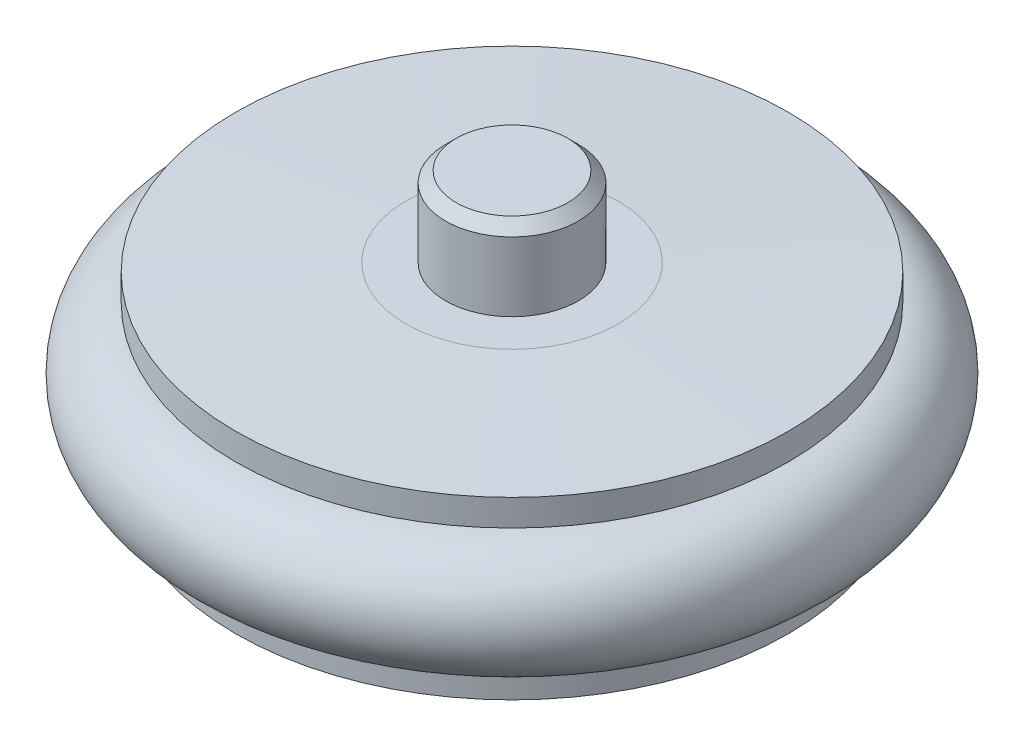
ISO-10303-21;
HEADER;
FILE_DESCRIPTION(('STEP AP214'),'2;1');
FILE_NAME('part.step','',(''),(''),'','','');
FILE_SCHEMA(('AUTOMOTIVE_DESIGN { 1 0 10303 214 1 1 1 1 }'));
ENDSEC;
DATA;
#1=APPLICATION_CONTEXT('core data for automotive mechanical design processes');
#2=APPLICATION_PROTOCOL_DEFINITION('international standard','automotive_design',2000,#1);
#3=PRODUCT_CONTEXT('',#1,'mechanical');
#4=PRODUCT('Part','Part','',(#3));
#5=PRODUCT_RELATED_PRODUCT_CATEGORY('part','',(#4));
#6=PRODUCT_DEFINITION_FORMATION('','',#4);
#7=PRODUCT_DEFINITION_CONTEXT('part definition',#1,'design');
#8=PRODUCT_DEFINITION('design','',#6,#7);
#9=PRODUCT_DEFINITION_SHAPE('','',#8);
#10=(LENGTH_UNIT() NAMED_UNIT(*) SI_UNIT(.MILLI.,.METRE.));
#11=(NAMED_UNIT(*) PLANE_ANGLE_UNIT() SI_UNIT($,.RADIAN.));
#12=(NAMED_UNIT(*) SI_UNIT($,.STERADIAN.) SOLID_ANGLE_UNIT());
#13=UNCERTAINTY_MEASURE_WITH_UNIT(LENGTH_MEASURE(1.E-05),#10,'distance_accuracy_value','');
#14=(GEOMETRIC_REPRESENTATION_CONTEXT(3) GLOBAL_UNCERTAINTY_ASSIGNED_CONTEXT((#13)) GLOBAL_UNIT_ASSIGNED_CONTEXT((#10,
#11,#12)) REPRESENTATION_CONTEXT('',''));
#15=CARTESIAN_POINT('',(0.,0.,0.));
#16=DIRECTION('',(0.,0.,1.));
#17=DIRECTION('',(1.,0.,0.));
#18=AXIS2_PLACEMENT_3D('',#15,#16,#17);
#19=CARTESIAN_POINT('',(0.,0.,0.));
#20=DIRECTION('',(0.,1.,0.));
#21=DIRECTION('',(0.,0.,1.));
#22=AXIS2_PLACEMENT_3D('',#19,#20,#21);
#23=TOROIDAL_SURFACE('',#22,5.1,1.1);
#24=CARTESIAN_POINT('',(0.,0.,6.2));
#25=VERTEX_POINT('',#24);
#26=VERTEX_LOOP('',#25);
#27=FACE_BOUND('',#26,.T.);
#28=ADVANCED_FACE('F41',(#27),#23,.T.);
#29=CLOSED_SHELL('',(#28));
#30=MANIFOLD_SOLID_BREP('B2',#29);
#31=CARTESIAN_POINT('',(0.,3.10000000000011,0.));
#32=DIRECTION('',(0.,-1.,0.));
#33=DIRECTION('',(0.,0.,-1.));
#34=AXIS2_PLACEMENT_3D('',#31,#32,#33);
#35=CONICAL_SURFACE('',#34,1.25000000000003,0.785398163397749);
#36=CARTESIAN_POINT('',(0.,3.3,0.));
#37=DIRECTION('',(0.,-1.,0.));
#38=DIRECTION('',(0.,0.,-1.));
#39=AXIS2_PLACEMENT_3D('',#36,#37,#38);
#40=CIRCLE('',#39,1.05000000000002);
#41=CARTESIAN_POINT('',(0.,3.3,-1.05000000000002));
#42=VERTEX_POINT('',#41);
#43=EDGE_CURVE('E100',#42,#42,#40,.T.);
#44=ORIENTED_EDGE('',*,*,#43,.T.);
#45=EDGE_LOOP('',(#44));
#46=FACE_BOUND('',#45,.T.);
#47=CARTESIAN_POINT('',(0.,3.10000000000011,0.));
#48=DIRECTION('',(0.,-1.,0.));
#49=DIRECTION('',(0.,0.,-1.));
#50=AXIS2_PLACEMENT_3D('',#47,#48,#49);
#51=CIRCLE('',#50,1.25000000000003);
#52=CARTESIAN_POINT('',(0.,3.10000000000011,-1.25000000000003));
#53=VERTEX_POINT('',#52);
#54=EDGE_CURVE('E40',#53,#53,#51,.T.);
#55=ORIENTED_EDGE('',*,*,#54,.F.);
#56=EDGE_LOOP('',(#55));
#57=FACE_BOUND('',#56,.T.);
#58=ADVANCED_FACE('F54',(#46,#57),#35,.T.);
#59=CARTESIAN_POINT('',(0.,3.3,0.));
#60=DIRECTION('',(0.,-1.,0.));
#61=DIRECTION('',(0.,0.,-1.));
#62=AXIS2_PLACEMENT_3D('',#59,#60,#61);
#63=CYLINDRICAL_SURFACE('',#62,1.25000000000003);
#64=ORIENTED_EDGE('',*,*,#54,.T.);
#65=EDGE_LOOP('',(#64));
#66=FACE_BOUND('',#65,.T.);
#67=CARTESIAN_POINT('',(0.,1.80000000000011,0.));
#68=DIRECTION('',(0.,-1.,0.));
#69=DIRECTION('',(0.,0.,-1.));
#70=AXIS2_PLACEMENT_3D('',#67,#68,#69);
#71=CIRCLE('',#70,1.25000000000003);
#72=CARTESIAN_POINT('',(0.,1.80000000000011,-1.25000000000003));
#73=VERTEX_POINT('',#72);
#74=EDGE_CURVE('E60',#73,#73,#71,.T.);
#75=ORIENTED_EDGE('',*,*,#74,.F.);
#76=EDGE_LOOP('',(#75));
#77=FACE_BOUND('',#76,.T.);
#78=ADVANCED_FACE('F117',(#66,#77),#63,.T.);
#79=CARTESIAN_POINT('',(2.00000000000039,1.80000000000011,0.));
#80=DIRECTION('',(0.,1.,0.));
#81=DIRECTION('',(0.,0.,1.));
#82=AXIS2_PLACEMENT_3D('',#79,#80,#81);
#83=PLANE('',#82);
#84=ORIENTED_EDGE('',*,*,#74,.T.);
#85=EDGE_LOOP('',(#84));
#86=FACE_BOUND('',#85,.T.);
#87=CARTESIAN_POINT('',(0.,1.80000000000011,0.));
#88=DIRECTION('',(0.,-1.,0.));
#89=DIRECTION('',(0.,0.,-1.));
#90=AXIS2_PLACEMENT_3D('',#87,#88,#89);
#91=CIRCLE('',#90,2.00000000000039);
#92=CARTESIAN_POINT('',(0.,1.80000000000011,-2.00000000000039));
#93=VERTEX_POINT('',#92);
#94=EDGE_CURVE('E64',#93,#93,#91,.T.);
#95=ORIENTED_EDGE('',*,*,#94,.F.);
#96=EDGE_LOOP('',(#95));
#97=FACE_BOUND('',#96,.T.);
#98=ADVANCED_FACE('F121',(#86,#97),#83,.T.);
#99=CARTESIAN_POINT('',(0.,1.65,0.));
#100=DIRECTION('',(0.,-1.,0.));
#101=DIRECTION('',(0.,0.,-1.));
#102=AXIS2_PLACEMENT_3D('',#99,#100,#101);
#103=CONICAL_SURFACE('',#102,5.2,1.52395561387889);
#104=ORIENTED_EDGE('',*,*,#94,.T.);
#105=EDGE_LOOP('',(#104));
#106=FACE_BOUND('',#105,.T.);
#107=CARTESIAN_POINT('',(0.,1.65,0.));
#108=DIRECTION('',(0.,-1.,0.));
#109=DIRECTION('',(0.,0.,-1.));
#110=AXIS2_PLACEMENT_3D('',#107,#108,#109);
#111=CIRCLE('',#110,5.2);
#112=CARTESIAN_POINT('',(0.,1.65,-5.2));
#113=VERTEX_POINT('',#112);
#114=EDGE_CURVE('E68',#113,#113,#111,.T.);
#115=ORIENTED_EDGE('',*,*,#114,.F.);
#116=EDGE_LOOP('',(#115));
#117=FACE_BOUND('',#116,.T.);
#118=ADVANCED_FACE('F125',(#106,#117),#103,.T.);
#119=CARTESIAN_POINT('',(0.,3.3,0.));
#120=DIRECTION('',(0.,-1.,0.));
#121=DIRECTION('',(0.,0.,-1.));
#122=AXIS2_PLACEMENT_3D('',#119,#120,#121);
#123=CYLINDRICAL_SURFACE('',#122,5.2);
#124=ORIENTED_EDGE('',*,*,#114,.T.);
#125=EDGE_LOOP('',(#124));
#126=FACE_BOUND('',#125,.T.);
#127=CARTESIAN_POINT('',(0.,1.15,0.));
#128=DIRECTION('',(0.,-1.,0.));
#129=DIRECTION('',(0.,0.,-1.));
#130=AXIS2_PLACEMENT_3D('',#127,#128,#129);
#131=CIRCLE('',#130,5.2);
#132=CARTESIAN_POINT('',(0.,1.15,-5.2));
#133=VERTEX_POINT('',#132);
#134=EDGE_CURVE('E73',#133,#133,#131,.T.);
#135=ORIENTED_EDGE('',*,*,#134,.F.);
#136=EDGE_LOOP('',(#135));
#137=FACE_BOUND('',#136,.T.);
#138=ADVANCED_FACE('F131',(#126,#137),#123,.T.);
#139=CARTESIAN_POINT('',(3.9,1.15,0.));
#140=DIRECTION('',(0.,-1.,0.));
#141=DIRECTION('',(0.,0.,-1.));
#142=AXIS2_PLACEMENT_3D('',#139,#140,#141);
#143=PLANE('',#142);
#144=ORIENTED_EDGE('',*,*,#134,.T.);
#145=EDGE_LOOP('',(#144));
#146=FACE_BOUND('',#145,.T.);
#147=CARTESIAN_POINT('',(0.,1.15,0.));
#148=DIRECTION('',(0.,-1.,0.));
#149=DIRECTION('',(0.,0.,-1.));
#150=AXIS2_PLACEMENT_3D('',#147,#148,#149);
#151=CIRCLE('',#150,3.9);
#152=CARTESIAN_POINT('',(0.,1.15,-3.9));
#153=VERTEX_POINT('',#152);
#154=EDGE_CURVE('E76',#153,#153,#151,.T.);
#155=ORIENTED_EDGE('',*,*,#154,.F.);
#156=EDGE_LOOP('',(#155));
#157=FACE_BOUND('',#156,.T.);
#158=ADVANCED_FACE('F135',(#146,#157),#143,.T.);
#159=CARTESIAN_POINT('',(0.,3.3,0.));
#160=DIRECTION('',(0.,-1.,0.));
#161=DIRECTION('',(0.,0.,-1.));
#162=AXIS2_PLACEMENT_3D('',#159,#160,#161);
#163=CYLINDRICAL_SURFACE('',#162,3.9);
#164=ORIENTED_EDGE('',*,*,#154,.T.);
#165=EDGE_LOOP('',(#164));
#166=FACE_BOUND('',#165,.T.);
#167=CARTESIAN_POINT('',(0.,-1.15,0.));
#168=DIRECTION('',(0.,-1.,0.));
#169=DIRECTION('',(0.,0.,-1.));
#170=AXIS2_PLACEMENT_3D('',#167,#168,#169);
#171=CIRCLE('',#170,3.9);
#172=CARTESIAN_POINT('',(0.,-1.15,-3.9));
#173=VERTEX_POINT('',#172);
#174=EDGE_CURVE('E79',#173,#173,#171,.T.);
#175=ORIENTED_EDGE('',*,*,#174,.F.);
#176=EDGE_LOOP('',(#175));
#177=FACE_BOUND('',#176,.T.);
#178=ADVANCED_FACE('F139',(#166,#177),#163,.T.);
#179=CARTESIAN_POINT('',(5.2,-1.15,0.));
#180=DIRECTION('',(0.,1.,0.));
#181=DIRECTION('',(0.,0.,1.));
#182=AXIS2_PLACEMENT_3D('',#179,#180,#181);
#183=PLANE('',#182);
#184=ORIENTED_EDGE('',*,*,#174,.T.);
#185=EDGE_LOOP('',(#184));
#186=FACE_BOUND('',#185,.T.);
#187=CARTESIAN_POINT('',(0.,-1.15,0.));
#188=DIRECTION('',(0.,-1.,0.));
#189=DIRECTION('',(0.,0.,-1.));
#190=AXIS2_PLACEMENT_3D('',#187,#188,#189);
#191=CIRCLE('',#190,5.2);
#192=CARTESIAN_POINT('',(0.,-1.15,-5.2));
#193=VERTEX_POINT('',#192);
#194=EDGE_CURVE('E82',#193,#193,#191,.T.);
#195=ORIENTED_EDGE('',*,*,#194,.F.);
#196=EDGE_LOOP('',(#195));
#197=FACE_BOUND('',#196,.T.);
#198=ADVANCED_FACE('F143',(#186,#197),#183,.T.);
#199=CARTESIAN_POINT('',(0.,3.3,0.));
#200=DIRECTION('',(0.,-1.,0.));
#201=DIRECTION('',(0.,0.,-1.));
#202=AXIS2_PLACEMENT_3D('',#199,#200,#201);
#203=CYLINDRICAL_SURFACE('',#202,5.2);
#204=ORIENTED_EDGE('',*,*,#194,.T.);
#205=EDGE_LOOP('',(#204));
#206=FACE_BOUND('',#205,.T.);
#207=CARTESIAN_POINT('',(0.,-1.65,0.));
#208=DIRECTION('',(0.,-1.,0.));
#209=DIRECTION('',(0.,0.,-1.));
#210=AXIS2_PLACEMENT_3D('',#207,#208,#209);
#211=CIRCLE('',#210,5.2);
#212=CARTESIAN_POINT('',(0.,-1.65,-5.2));
#213=VERTEX_POINT('',#212);
#214=EDGE_CURVE('E85',#213,#213,#211,.T.);
#215=ORIENTED_EDGE('',*,*,#214,.F.);
#216=EDGE_LOOP('',(#215));
#217=FACE_BOUND('',#216,.T.);
#218=ADVANCED_FACE('F147',(#206,#217),#203,.T.);
#219=CARTESIAN_POINT('',(0.,-1.79999999999986,0.));
#220=DIRECTION('',(0.,1.,0.));
#221=DIRECTION('',(0.,0.,1.));
#222=AXIS2_PLACEMENT_3D('',#219,#220,#221);
#223=CONICAL_SURFACE('',#222,2.,1.52395561387897);
#224=ORIENTED_EDGE('',*,*,#214,.T.);
#225=EDGE_LOOP('',(#224));
#226=FACE_BOUND('',#225,.T.);
#227=CARTESIAN_POINT('',(0.,-1.79999999999986,0.));
#228=DIRECTION('',(0.,-1.,0.));
#229=DIRECTION('',(0.,0.,-1.));
#230=AXIS2_PLACEMENT_3D('',#227,#228,#229);
#231=CIRCLE('',#230,2.);
#232=CARTESIAN_POINT('',(0.,-1.79999999999986,-2.));
#233=VERTEX_POINT('',#232);
#234=EDGE_CURVE('E88',#233,#233,#231,.T.);
#235=ORIENTED_EDGE('',*,*,#234,.F.);
#236=EDGE_LOOP('',(#235));
#237=FACE_BOUND('',#236,.T.);
#238=ADVANCED_FACE('F151',(#226,#237),#223,.T.);
#239=CARTESIAN_POINT('',(1.25000000000003,-1.79999999999986,0.));
#240=DIRECTION('',(0.,-1.,0.));
#241=DIRECTION('',(0.,0.,-1.));
#242=AXIS2_PLACEMENT_3D('',#239,#240,#241);
#243=PLANE('',#242);
#244=ORIENTED_EDGE('',*,*,#234,.T.);
#245=EDGE_LOOP('',(#244));
#246=FACE_BOUND('',#245,.T.);
#247=CARTESIAN_POINT('',(0.,-1.79999999999986,0.));
#248=DIRECTION('',(0.,-1.,0.));
#249=DIRECTION('',(0.,0.,-1.));
#250=AXIS2_PLACEMENT_3D('',#247,#248,#249);
#251=CIRCLE('',#250,1.25000000000003);
#252=CARTESIAN_POINT('',(0.,-1.79999999999986,-1.25000000000003));
#253=VERTEX_POINT('',#252);
#254=EDGE_CURVE('E91',#253,#253,#251,.T.);
#255=ORIENTED_EDGE('',*,*,#254,.F.);
#256=EDGE_LOOP('',(#255));
#257=FACE_BOUND('',#256,.T.);
#258=ADVANCED_FACE('F155',(#246,#257),#243,.T.);
#259=CARTESIAN_POINT('',(0.,3.3,0.));
#260=DIRECTION('',(0.,-1.,0.));
#261=DIRECTION('',(0.,0.,-1.));
#262=AXIS2_PLACEMENT_3D('',#259,#260,#261);
#263=CYLINDRICAL_SURFACE('',#262,1.25000000000003);
#264=ORIENTED_EDGE('',*,*,#254,.T.);
#265=EDGE_LOOP('',(#264));
#266=FACE_BOUND('',#265,.T.);
#267=CARTESIAN_POINT('',(0.,-3.09999999999986,0.));
#268=DIRECTION('',(0.,-1.,0.));
#269=DIRECTION('',(0.,0.,-1.));
#270=AXIS2_PLACEMENT_3D('',#267,#268,#269);
#271=CIRCLE('',#270,1.25000000000003);
#272=CARTESIAN_POINT('',(0.,-3.09999999999986,-1.25000000000003));
#273=VERTEX_POINT('',#272);
#274=EDGE_CURVE('E94',#273,#273,#271,.T.);
#275=ORIENTED_EDGE('',*,*,#274,.F.);
#276=EDGE_LOOP('',(#275));
#277=FACE_BOUND('',#276,.T.);
#278=ADVANCED_FACE('F159',(#266,#277),#263,.T.);
#279=CARTESIAN_POINT('',(0.,-3.3,0.));
#280=DIRECTION('',(0.,1.,0.));
#281=DIRECTION('',(0.,0.,1.));
#282=AXIS2_PLACEMENT_3D('',#279,#280,#281);
#283=CONICAL_SURFACE('',#282,1.05,0.785398163397174);
#284=ORIENTED_EDGE('',*,*,#274,.T.);
#285=EDGE_LOOP('',(#284));
#286=FACE_BOUND('',#285,.T.);
#287=CARTESIAN_POINT('',(0.,-3.3,0.));
#288=DIRECTION('',(0.,-1.,0.));
#289=DIRECTION('',(0.,0.,-1.));
#290=AXIS2_PLACEMENT_3D('',#287,#288,#289);
#291=CIRCLE('',#290,1.05);
#292=CARTESIAN_POINT('',(0.,-3.3,-1.05));
#293=VERTEX_POINT('',#292);
#294=EDGE_CURVE('E97',#293,#293,#291,.T.);
#295=ORIENTED_EDGE('',*,*,#294,.F.);
#296=EDGE_LOOP('',(#295));
#297=FACE_BOUND('',#296,.T.);
#298=ADVANCED_FACE('F113',(#286,#297),#283,.T.);
#299=CARTESIAN_POINT('',(0.,-3.3,0.));
#300=DIRECTION('',(0.,-1.,0.));
#301=DIRECTION('',(0.,0.,-1.));
#302=AXIS2_PLACEMENT_3D('',#299,#300,#301);
#303=PLANE('',#302);
#304=ORIENTED_EDGE('',*,*,#294,.T.);
#305=EDGE_LOOP('',(#304));
#306=FACE_BOUND('',#305,.T.);
#307=ADVANCED_FACE('F108',(#306),#303,.T.);
#308=CARTESIAN_POINT('',(1.05000000000002,3.3,0.));
#309=DIRECTION('',(0.,1.,0.));
#310=DIRECTION('',(0.,0.,1.));
#311=AXIS2_PLACEMENT_3D('',#308,#309,#310);
#312=PLANE('',#311);
#313=ORIENTED_EDGE('',*,*,#43,.F.);
#314=EDGE_LOOP('',(#313));
#315=FACE_BOUND('',#314,.T.);
#316=ADVANCED_FACE('F106',(#315),#312,.T.);
#317=CLOSED_SHELL('',(#58,#78,#98,#118,#138,#158,#178,#198,#218,#238,#258,#278,#298,#307,#316));
#318=MANIFOLD_SOLID_BREP('B6',#317);
#319=ADVANCED_BREP_SHAPE_REPRESENTATION('',(#18,#30,#318),#14);
#320=SHAPE_DEFINITION_REPRESENTATION(#9,#319);
ENDSEC;
END-ISO-10303-21;
